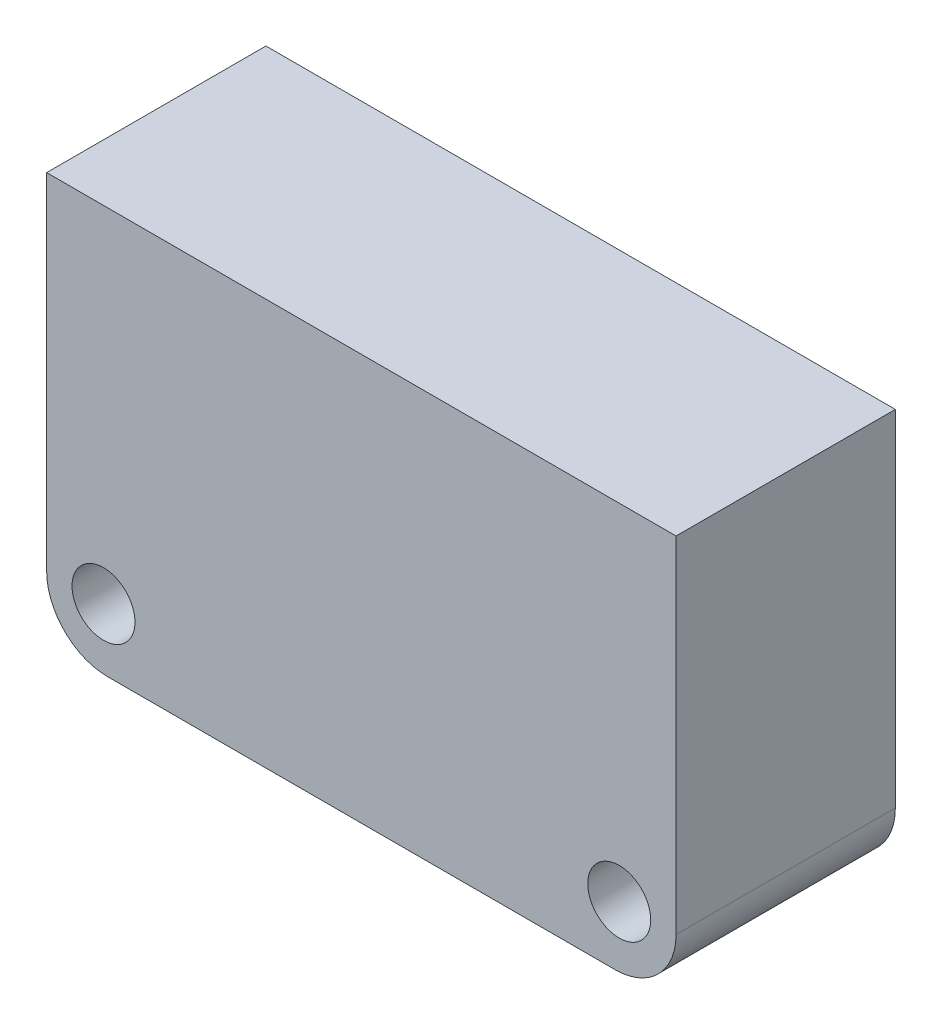
ISO-10303-21;
HEADER;
FILE_DESCRIPTION(('STEP AP214'),'2;1');
FILE_NAME('part.step','',(''),(''),'','','');
FILE_SCHEMA(('AUTOMOTIVE_DESIGN { 1 0 10303 214 1 1 1 1 }'));
ENDSEC;
DATA;
#1=APPLICATION_CONTEXT('core data for automotive mechanical design processes');
#2=APPLICATION_PROTOCOL_DEFINITION('international standard','automotive_design',2000,#1);
#3=PRODUCT_CONTEXT('',#1,'mechanical');
#4=PRODUCT('Part','Part','',(#3));
#5=PRODUCT_RELATED_PRODUCT_CATEGORY('part','',(#4));
#6=PRODUCT_DEFINITION_FORMATION('','',#4);
#7=PRODUCT_DEFINITION_CONTEXT('part definition',#1,'design');
#8=PRODUCT_DEFINITION('design','',#6,#7);
#9=PRODUCT_DEFINITION_SHAPE('','',#8);
#10=(LENGTH_UNIT() NAMED_UNIT(*) SI_UNIT(.MILLI.,.METRE.));
#11=(NAMED_UNIT(*) PLANE_ANGLE_UNIT() SI_UNIT($,.RADIAN.));
#12=(NAMED_UNIT(*) SI_UNIT($,.STERADIAN.) SOLID_ANGLE_UNIT());
#13=UNCERTAINTY_MEASURE_WITH_UNIT(LENGTH_MEASURE(1.E-05),#10,'distance_accuracy_value','');
#14=(GEOMETRIC_REPRESENTATION_CONTEXT(3) GLOBAL_UNCERTAINTY_ASSIGNED_CONTEXT((#13)) GLOBAL_UNIT_ASSIGNED_CONTEXT((#10,
#11,#12)) REPRESENTATION_CONTEXT('',''));
#15=CARTESIAN_POINT('',(0.,0.,0.));
#16=DIRECTION('',(0.,0.,1.));
#17=DIRECTION('',(1.,0.,0.));
#18=AXIS2_PLACEMENT_3D('',#15,#16,#17);
#19=CARTESIAN_POINT('',(12.5,-7.,10.8));
#20=DIRECTION('',(0.,0.,1.));
#21=DIRECTION('',(1.,0.,0.));
#22=AXIS2_PLACEMENT_3D('',#19,#20,#21);
#23=CYLINDRICAL_SURFACE('',#22,3.);
#24=DIRECTION('',(0.,0.,1.));
#25=VECTOR('',#24,1.);
#26=CARTESIAN_POINT('',(12.5,-10.,10.8));
#27=LINE('',#26,#25);
#28=CARTESIAN_POINT('',(12.5,-10.,0.));
#29=VERTEX_POINT('',#28);
#30=CARTESIAN_POINT('',(12.5,-10.,10.8));
#31=VERTEX_POINT('',#30);
#32=EDGE_CURVE('E202',#29,#31,#27,.T.);
#33=ORIENTED_EDGE('',*,*,#32,.F.);
#34=CARTESIAN_POINT('',(12.5,-7.,0.));
#35=DIRECTION('',(0.,0.,1.));
#36=DIRECTION('',(1.,0.,0.));
#37=AXIS2_PLACEMENT_3D('',#34,#35,#36);
#38=CIRCLE('',#37,3.);
#39=CARTESIAN_POINT('',(15.5,-7.,0.));
#40=VERTEX_POINT('',#39);
#41=EDGE_CURVE('E50',#40,#29,#38,.F.);
#42=ORIENTED_EDGE('',*,*,#41,.F.);
#43=DIRECTION('',(0.,0.,1.));
#44=VECTOR('',#43,1.);
#45=CARTESIAN_POINT('',(15.5,-7.,10.8));
#46=LINE('',#45,#44);
#47=CARTESIAN_POINT('',(15.5,-7.,10.8));
#48=VERTEX_POINT('',#47);
#49=EDGE_CURVE('E205',#48,#40,#46,.F.);
#50=ORIENTED_EDGE('',*,*,#49,.F.);
#51=CARTESIAN_POINT('',(12.5,-7.,10.8));
#52=DIRECTION('',(0.,0.,1.));
#53=DIRECTION('',(1.,0.,0.));
#54=AXIS2_PLACEMENT_3D('',#51,#52,#53);
#55=CIRCLE('',#54,3.);
#56=EDGE_CURVE('E11',#31,#48,#55,.T.);
#57=ORIENTED_EDGE('',*,*,#56,.F.);
#58=EDGE_LOOP('',(#33,#42,#50,#57));
#59=FACE_BOUND('',#58,.T.);
#60=ADVANCED_FACE('F43',(#59),#23,.T.);
#61=CARTESIAN_POINT('',(-12.5,-7.,10.8));
#62=DIRECTION('',(0.,0.,1.));
#63=DIRECTION('',(1.,0.,0.));
#64=AXIS2_PLACEMENT_3D('',#61,#62,#63);
#65=CYLINDRICAL_SURFACE('',#64,3.);
#66=DIRECTION('',(0.,0.,1.));
#67=VECTOR('',#66,1.);
#68=CARTESIAN_POINT('',(-15.5,-7.,10.8));
#69=LINE('',#68,#67);
#70=CARTESIAN_POINT('',(-15.5,-7.,0.));
#71=VERTEX_POINT('',#70);
#72=CARTESIAN_POINT('',(-15.5,-7.,10.8));
#73=VERTEX_POINT('',#72);
#74=EDGE_CURVE('E192',#71,#73,#69,.T.);
#75=ORIENTED_EDGE('',*,*,#74,.F.);
#76=CARTESIAN_POINT('',(-12.5,-7.,0.));
#77=DIRECTION('',(0.,0.,1.));
#78=DIRECTION('',(1.,0.,0.));
#79=AXIS2_PLACEMENT_3D('',#76,#77,#78);
#80=CIRCLE('',#79,3.);
#81=CARTESIAN_POINT('',(-12.5,-10.,0.));
#82=VERTEX_POINT('',#81);
#83=EDGE_CURVE('E198',#82,#71,#80,.F.);
#84=ORIENTED_EDGE('',*,*,#83,.F.);
#85=DIRECTION('',(0.,0.,1.));
#86=VECTOR('',#85,1.);
#87=CARTESIAN_POINT('',(-12.5,-10.,10.8));
#88=LINE('',#87,#86);
#89=CARTESIAN_POINT('',(-12.5,-10.,10.8));
#90=VERTEX_POINT('',#89);
#91=EDGE_CURVE('E195',#90,#82,#88,.F.);
#92=ORIENTED_EDGE('',*,*,#91,.F.);
#93=CARTESIAN_POINT('',(-12.5,-7.,10.8));
#94=DIRECTION('',(0.,0.,1.));
#95=DIRECTION('',(1.,0.,0.));
#96=AXIS2_PLACEMENT_3D('',#93,#94,#95);
#97=CIRCLE('',#96,3.);
#98=EDGE_CURVE('E200',#73,#90,#97,.T.);
#99=ORIENTED_EDGE('',*,*,#98,.F.);
#100=EDGE_LOOP('',(#75,#84,#92,#99));
#101=FACE_BOUND('',#100,.T.);
#102=ADVANCED_FACE('F220',(#101),#65,.T.);
#103=CARTESIAN_POINT('',(15.5,10.,10.8));
#104=DIRECTION('',(-1.,0.,0.));
#105=DIRECTION('',(0.,0.,1.));
#106=AXIS2_PLACEMENT_3D('',#103,#104,#105);
#107=PLANE('',#106);
#108=DIRECTION('',(0.,1.,0.));
#109=VECTOR('',#108,1.);
#110=CARTESIAN_POINT('',(15.5,10.,10.8));
#111=LINE('',#110,#109);
#112=CARTESIAN_POINT('',(15.5,10.,10.8));
#113=VERTEX_POINT('',#112);
#114=EDGE_CURVE('E168',#48,#113,#111,.T.);
#115=ORIENTED_EDGE('',*,*,#114,.F.);
#116=ORIENTED_EDGE('',*,*,#49,.T.);
#117=DIRECTION('',(0.,1.,0.));
#118=VECTOR('',#117,1.);
#119=CARTESIAN_POINT('',(15.5,10.,0.));
#120=LINE('',#119,#118);
#121=CARTESIAN_POINT('',(15.5,10.,0.));
#122=VERTEX_POINT('',#121);
#123=EDGE_CURVE('E159',#40,#122,#120,.T.);
#124=ORIENTED_EDGE('',*,*,#123,.T.);
#125=DIRECTION('',(0.,0.,-1.));
#126=VECTOR('',#125,1.);
#127=CARTESIAN_POINT('',(15.5,10.,10.8));
#128=LINE('',#127,#126);
#129=EDGE_CURVE('E189',#113,#122,#128,.T.);
#130=ORIENTED_EDGE('',*,*,#129,.F.);
#131=EDGE_LOOP('',(#115,#116,#124,#130));
#132=FACE_BOUND('',#131,.T.);
#133=ADVANCED_FACE('F232',(#132),#107,.F.);
#134=CARTESIAN_POINT('',(-15.5,10.,10.8));
#135=DIRECTION('',(0.,-1.,0.));
#136=DIRECTION('',(0.,0.,-1.));
#137=AXIS2_PLACEMENT_3D('',#134,#135,#136);
#138=PLANE('',#137);
#139=DIRECTION('',(-1.,0.,0.));
#140=VECTOR('',#139,1.);
#141=CARTESIAN_POINT('',(-15.5,10.,0.));
#142=LINE('',#141,#140);
#143=CARTESIAN_POINT('',(-15.5,10.,0.));
#144=VERTEX_POINT('',#143);
#145=EDGE_CURVE('E180',#122,#144,#142,.T.);
#146=ORIENTED_EDGE('',*,*,#145,.T.);
#147=DIRECTION('',(0.,0.,-1.));
#148=VECTOR('',#147,1.);
#149=CARTESIAN_POINT('',(-15.5,10.,10.8));
#150=LINE('',#149,#148);
#151=CARTESIAN_POINT('',(-15.5,10.,10.8));
#152=VERTEX_POINT('',#151);
#153=EDGE_CURVE('E178',#152,#144,#150,.T.);
#154=ORIENTED_EDGE('',*,*,#153,.F.);
#155=DIRECTION('',(-1.,0.,0.));
#156=VECTOR('',#155,1.);
#157=CARTESIAN_POINT('',(-15.5,10.,10.8));
#158=LINE('',#157,#156);
#159=EDGE_CURVE('E170',#113,#152,#158,.T.);
#160=ORIENTED_EDGE('',*,*,#159,.F.);
#161=ORIENTED_EDGE('',*,*,#129,.T.);
#162=EDGE_LOOP('',(#146,#154,#160,#161));
#163=FACE_BOUND('',#162,.T.);
#164=ADVANCED_FACE('F228',(#163),#138,.F.);
#165=CARTESIAN_POINT('',(-15.5,10.,10.8));
#166=DIRECTION('',(1.,0.,0.));
#167=DIRECTION('',(0.,0.,-1.));
#168=AXIS2_PLACEMENT_3D('',#165,#166,#167);
#169=PLANE('',#168);
#170=DIRECTION('',(0.,-1.,0.));
#171=VECTOR('',#170,1.);
#172=CARTESIAN_POINT('',(-15.5,10.,0.));
#173=LINE('',#172,#171);
#174=EDGE_CURVE('E182',#144,#71,#173,.T.);
#175=ORIENTED_EDGE('',*,*,#174,.T.);
#176=ORIENTED_EDGE('',*,*,#74,.T.);
#177=DIRECTION('',(0.,-1.,0.));
#178=VECTOR('',#177,1.);
#179=CARTESIAN_POINT('',(-15.5,10.,10.8));
#180=LINE('',#179,#178);
#181=EDGE_CURVE('E173',#152,#73,#180,.T.);
#182=ORIENTED_EDGE('',*,*,#181,.F.);
#183=ORIENTED_EDGE('',*,*,#153,.T.);
#184=EDGE_LOOP('',(#175,#176,#182,#183));
#185=FACE_BOUND('',#184,.T.);
#186=ADVANCED_FACE('F223',(#185),#169,.F.);
#187=CARTESIAN_POINT('',(-15.5,-10.,10.8));
#188=DIRECTION('',(0.,1.,0.));
#189=DIRECTION('',(0.,0.,1.));
#190=AXIS2_PLACEMENT_3D('',#187,#188,#189);
#191=PLANE('',#190);
#192=DIRECTION('',(-1.,0.,0.));
#193=VECTOR('',#192,1.);
#194=CARTESIAN_POINT('',(-7.5,-10.,7.9));
#195=LINE('',#194,#193);
#196=CARTESIAN_POINT('',(7.5,-10.,7.9));
#197=VERTEX_POINT('',#196);
#198=CARTESIAN_POINT('',(-7.5,-10.,7.9));
#199=VERTEX_POINT('',#198);
#200=EDGE_CURVE('E146',#197,#199,#195,.T.);
#201=ORIENTED_EDGE('',*,*,#200,.F.);
#202=DIRECTION('',(0.,0.,1.));
#203=VECTOR('',#202,1.);
#204=CARTESIAN_POINT('',(7.5,-10.,7.9));
#205=LINE('',#204,#203);
#206=CARTESIAN_POINT('',(7.5,-10.,2.9));
#207=VERTEX_POINT('',#206);
#208=EDGE_CURVE('E57',#207,#197,#205,.T.);
#209=ORIENTED_EDGE('',*,*,#208,.F.);
#210=DIRECTION('',(1.,0.,0.));
#211=VECTOR('',#210,1.);
#212=CARTESIAN_POINT('',(-7.5,-10.,2.9));
#213=LINE('',#212,#211);
#214=CARTESIAN_POINT('',(-7.5,-10.,2.9));
#215=VERTEX_POINT('',#214);
#216=EDGE_CURVE('E137',#215,#207,#213,.T.);
#217=ORIENTED_EDGE('',*,*,#216,.F.);
#218=DIRECTION('',(0.,0.,-1.));
#219=VECTOR('',#218,1.);
#220=CARTESIAN_POINT('',(-7.5,-10.,7.9));
#221=LINE('',#220,#219);
#222=EDGE_CURVE('E140',#199,#215,#221,.T.);
#223=ORIENTED_EDGE('',*,*,#222,.F.);
#224=EDGE_LOOP('',(#201,#209,#217,#223));
#225=FACE_BOUND('',#224,.T.);
#226=DIRECTION('',(1.,0.,0.));
#227=VECTOR('',#226,1.);
#228=CARTESIAN_POINT('',(-15.5,-10.,0.));
#229=LINE('',#228,#227);
#230=EDGE_CURVE('E171',#82,#29,#229,.T.);
#231=ORIENTED_EDGE('',*,*,#230,.T.);
#232=ORIENTED_EDGE('',*,*,#32,.T.);
#233=DIRECTION('',(1.,0.,0.));
#234=VECTOR('',#233,1.);
#235=CARTESIAN_POINT('',(-15.5,-10.,10.8));
#236=LINE('',#235,#234);
#237=EDGE_CURVE('E176',#90,#31,#236,.T.);
#238=ORIENTED_EDGE('',*,*,#237,.F.);
#239=ORIENTED_EDGE('',*,*,#91,.T.);
#240=EDGE_LOOP('',(#231,#232,#238,#239));
#241=FACE_BOUND('',#240,.T.);
#242=ADVANCED_FACE('F216',(#225,#241),#191,.F.);
#243=CARTESIAN_POINT('',(0.,0.,10.8));
#244=DIRECTION('',(0.,0.,1.));
#245=DIRECTION('',(1.,0.,0.));
#246=AXIS2_PLACEMENT_3D('',#243,#244,#245);
#247=PLANE('',#246);
#248=CARTESIAN_POINT('',(12.7,-7.,10.8));
#249=DIRECTION('',(0.,0.,-1.));
#250=DIRECTION('',(-1.,0.,0.));
#251=AXIS2_PLACEMENT_3D('',#248,#249,#250);
#252=CIRCLE('',#251,1.55);
#253=CARTESIAN_POINT('',(11.15,-7.,10.8));
#254=VERTEX_POINT('',#253);
#255=EDGE_CURVE('E156',#254,#254,#252,.T.);
#256=ORIENTED_EDGE('',*,*,#255,.T.);
#257=EDGE_LOOP('',(#256));
#258=FACE_BOUND('',#257,.T.);
#259=CARTESIAN_POINT('',(-12.7,-7.,10.8));
#260=DIRECTION('',(0.,0.,-1.));
#261=DIRECTION('',(-1.,0.,0.));
#262=AXIS2_PLACEMENT_3D('',#259,#260,#261);
#263=CIRCLE('',#262,1.55);
#264=CARTESIAN_POINT('',(-14.25,-7.,10.8));
#265=VERTEX_POINT('',#264);
#266=EDGE_CURVE('E152',#265,#265,#263,.T.);
#267=ORIENTED_EDGE('',*,*,#266,.T.);
#268=EDGE_LOOP('',(#267));
#269=FACE_BOUND('',#268,.T.);
#270=ORIENTED_EDGE('',*,*,#237,.T.);
#271=ORIENTED_EDGE('',*,*,#56,.T.);
#272=ORIENTED_EDGE('',*,*,#114,.T.);
#273=ORIENTED_EDGE('',*,*,#159,.T.);
#274=ORIENTED_EDGE('',*,*,#181,.T.);
#275=ORIENTED_EDGE('',*,*,#98,.T.);
#276=EDGE_LOOP('',(#270,#271,#272,#273,#274,#275));
#277=FACE_BOUND('',#276,.T.);
#278=ADVANCED_FACE('F233',(#258,#269,#277),#247,.T.);
#279=CARTESIAN_POINT('',(0.,0.,0.));
#280=DIRECTION('',(0.,0.,1.));
#281=DIRECTION('',(1.,0.,0.));
#282=AXIS2_PLACEMENT_3D('',#279,#280,#281);
#283=PLANE('',#282);
#284=CARTESIAN_POINT('',(12.7,-7.,0.));
#285=DIRECTION('',(0.,0.,-1.));
#286=DIRECTION('',(-1.,0.,0.));
#287=AXIS2_PLACEMENT_3D('',#284,#285,#286);
#288=CIRCLE('',#287,1.55);
#289=CARTESIAN_POINT('',(11.15,-7.,0.));
#290=VERTEX_POINT('',#289);
#291=EDGE_CURVE('E160',#290,#290,#288,.T.);
#292=ORIENTED_EDGE('',*,*,#291,.F.);
#293=EDGE_LOOP('',(#292));
#294=FACE_BOUND('',#293,.T.);
#295=CARTESIAN_POINT('',(-12.7,-7.,0.));
#296=DIRECTION('',(0.,0.,-1.));
#297=DIRECTION('',(-1.,0.,0.));
#298=AXIS2_PLACEMENT_3D('',#295,#296,#297);
#299=CIRCLE('',#298,1.55);
#300=CARTESIAN_POINT('',(-14.25,-7.,0.));
#301=VERTEX_POINT('',#300);
#302=EDGE_CURVE('E163',#301,#301,#299,.T.);
#303=ORIENTED_EDGE('',*,*,#302,.F.);
#304=EDGE_LOOP('',(#303));
#305=FACE_BOUND('',#304,.T.);
#306=ORIENTED_EDGE('',*,*,#123,.F.);
#307=ORIENTED_EDGE('',*,*,#41,.T.);
#308=ORIENTED_EDGE('',*,*,#230,.F.);
#309=ORIENTED_EDGE('',*,*,#83,.T.);
#310=ORIENTED_EDGE('',*,*,#174,.F.);
#311=ORIENTED_EDGE('',*,*,#145,.F.);
#312=EDGE_LOOP('',(#306,#307,#308,#309,#310,#311));
#313=FACE_BOUND('',#312,.T.);
#314=ADVANCED_FACE('F211',(#294,#305,#313),#283,.F.);
#315=CARTESIAN_POINT('',(-12.7,-7.,10.8));
#316=DIRECTION('',(0.,0.,-1.));
#317=DIRECTION('',(-1.,0.,0.));
#318=AXIS2_PLACEMENT_3D('',#315,#316,#317);
#319=CYLINDRICAL_SURFACE('',#318,1.55);
#320=CARTESIAN_POINT('',(-14.25,-7.,10.8));
#321=CARTESIAN_POINT('',(-14.25,-7.,10.6875));
#322=CARTESIAN_POINT('',(-14.25,-7.,10.575));
#323=CARTESIAN_POINT('',(-14.25,-7.,10.35));
#324=CARTESIAN_POINT('',(-14.25,-7.,10.2375));
#325=CARTESIAN_POINT('',(-14.25,-7.,10.0125));
#326=CARTESIAN_POINT('',(-14.25,-7.,9.9));
#327=CARTESIAN_POINT('',(-14.25,-7.,9.675));
#328=CARTESIAN_POINT('',(-14.25,-7.,9.5625));
#329=CARTESIAN_POINT('',(-14.25,-7.,9.3375));
#330=CARTESIAN_POINT('',(-14.25,-7.,9.225));
#331=CARTESIAN_POINT('',(-14.25,-7.,9.));
#332=CARTESIAN_POINT('',(-14.25,-7.,8.8875));
#333=CARTESIAN_POINT('',(-14.25,-7.,8.6625));
#334=CARTESIAN_POINT('',(-14.25,-7.,8.55));
#335=CARTESIAN_POINT('',(-14.25,-7.,8.325));
#336=CARTESIAN_POINT('',(-14.25,-7.,8.2125));
#337=CARTESIAN_POINT('',(-14.25,-7.,7.9875));
#338=CARTESIAN_POINT('',(-14.25,-7.,7.875));
#339=CARTESIAN_POINT('',(-14.25,-7.,7.65));
#340=CARTESIAN_POINT('',(-14.25,-7.,7.5375));
#341=CARTESIAN_POINT('',(-14.25,-7.,7.3125));
#342=CARTESIAN_POINT('',(-14.25,-7.,7.2));
#343=CARTESIAN_POINT('',(-14.25,-7.,6.975));
#344=CARTESIAN_POINT('',(-14.25,-7.,6.8625));
#345=CARTESIAN_POINT('',(-14.25,-7.,6.6375));
#346=CARTESIAN_POINT('',(-14.25,-7.,6.525));
#347=CARTESIAN_POINT('',(-14.25,-7.,6.3));
#348=CARTESIAN_POINT('',(-14.25,-7.,6.1875));
#349=CARTESIAN_POINT('',(-14.25,-7.,5.9625));
#350=CARTESIAN_POINT('',(-14.25,-7.,5.85));
#351=CARTESIAN_POINT('',(-14.25,-7.,5.625));
#352=CARTESIAN_POINT('',(-14.25,-7.,5.5125));
#353=CARTESIAN_POINT('',(-14.25,-7.,5.2875));
#354=CARTESIAN_POINT('',(-14.25,-7.,5.175));
#355=CARTESIAN_POINT('',(-14.25,-7.,4.95));
#356=CARTESIAN_POINT('',(-14.25,-7.,4.8375));
#357=CARTESIAN_POINT('',(-14.25,-7.,4.6125));
#358=CARTESIAN_POINT('',(-14.25,-7.,4.5));
#359=CARTESIAN_POINT('',(-14.25,-7.,4.275));
#360=CARTESIAN_POINT('',(-14.25,-7.,4.1625));
#361=CARTESIAN_POINT('',(-14.25,-7.,3.9375));
#362=CARTESIAN_POINT('',(-14.25,-7.,3.825));
#363=CARTESIAN_POINT('',(-14.25,-7.,3.6));
#364=CARTESIAN_POINT('',(-14.25,-7.,3.4875));
#365=CARTESIAN_POINT('',(-14.25,-7.,3.2625));
#366=CARTESIAN_POINT('',(-14.25,-7.,3.15));
#367=CARTESIAN_POINT('',(-14.25,-7.,2.925));
#368=CARTESIAN_POINT('',(-14.25,-7.,2.8125));
#369=CARTESIAN_POINT('',(-14.25,-7.,2.5875));
#370=CARTESIAN_POINT('',(-14.25,-7.,2.475));
#371=CARTESIAN_POINT('',(-14.25,-7.,2.25));
#372=CARTESIAN_POINT('',(-14.25,-7.,2.1375));
#373=CARTESIAN_POINT('',(-14.25,-7.,1.9125));
#374=CARTESIAN_POINT('',(-14.25,-7.,1.8));
#375=CARTESIAN_POINT('',(-14.25,-7.,1.575));
#376=CARTESIAN_POINT('',(-14.25,-7.,1.4625));
#377=CARTESIAN_POINT('',(-14.25,-7.,1.2375));
#378=CARTESIAN_POINT('',(-14.25,-7.,1.125));
#379=CARTESIAN_POINT('',(-14.25,-7.,0.900000000000001));
#380=CARTESIAN_POINT('',(-14.25,-7.,0.787500000000002));
#381=CARTESIAN_POINT('',(-14.25,-7.,0.562500000000002));
#382=CARTESIAN_POINT('',(-14.25,-7.,0.450000000000001));
#383=CARTESIAN_POINT('',(-14.25,-7.,0.225000000000001));
#384=CARTESIAN_POINT('',(-14.25,-7.,0.112500000000001));
#385=CARTESIAN_POINT('',(-14.25,-7.,0.));
#386=B_SPLINE_CURVE_WITH_KNOTS('',3,(#320,#321,#322,#323,#324,#325,#326,#327,#328,#329,#330,
#331,#332,#333,#334,#335,#336,#337,#338,#339,#340,#341,#342,#343,#344,#345,#346,#347,#348,#349,
#350,#351,#352,#353,#354,#355,#356,#357,#358,#359,#360,#361,#362,#363,#364,#365,#366,#367,#368,
#369,#370,#371,#372,#373,#374,#375,#376,#377,#378,#379,#380,#381,#382,#383,#384,#385),
.UNSPECIFIED.,.F.,.F.,(4,2,2,2,2,2,2,2,2,2,2,2,2,2,2,2,2,2,2,2,2,2,2,2,2,2,2,2,2,2,2,2,4),(0.,
0.337499999999999,0.674999999999998,1.0125,1.35,1.6875,2.025,2.3625,2.7,3.0375,3.375,3.7125,
4.05,4.3875,4.725,5.0625,5.4,5.7375,6.075,6.4125,6.75,7.0875,7.425,7.7625,8.1,8.4375,8.775,
9.1125,9.45,9.7875,10.125,10.4625,10.8),.UNSPECIFIED.);
#387=EDGE_CURVE('BSEAM241',#265,#301,#386,.T.);
#388=ORIENTED_EDGE('',*,*,#266,.F.);
#389=ORIENTED_EDGE('',*,*,#302,.T.);
#390=ORIENTED_EDGE('',*,*,#387,.T.);
#391=ORIENTED_EDGE('',*,*,#387,.F.);
#392=EDGE_LOOP('',(#388,#390,#389,#391));
#393=FACE_BOUND('',#392,.T.);
#394=ADVANCED_FACE('F241',(#393),#319,.F.);
#395=CARTESIAN_POINT('',(12.7,-7.,10.8));
#396=DIRECTION('',(0.,0.,-1.));
#397=DIRECTION('',(-1.,0.,0.));
#398=AXIS2_PLACEMENT_3D('',#395,#396,#397);
#399=CYLINDRICAL_SURFACE('',#398,1.55);
#400=CARTESIAN_POINT('',(11.15,-7.,10.8));
#401=CARTESIAN_POINT('',(11.15,-7.,10.6875));
#402=CARTESIAN_POINT('',(11.15,-7.,10.575));
#403=CARTESIAN_POINT('',(11.15,-7.,10.35));
#404=CARTESIAN_POINT('',(11.15,-7.,10.2375));
#405=CARTESIAN_POINT('',(11.15,-7.,10.0125));
#406=CARTESIAN_POINT('',(11.15,-7.,9.9));
#407=CARTESIAN_POINT('',(11.15,-7.,9.675));
#408=CARTESIAN_POINT('',(11.15,-7.,9.5625));
#409=CARTESIAN_POINT('',(11.15,-7.,9.3375));
#410=CARTESIAN_POINT('',(11.15,-7.,9.225));
#411=CARTESIAN_POINT('',(11.15,-7.,9.));
#412=CARTESIAN_POINT('',(11.15,-7.,8.8875));
#413=CARTESIAN_POINT('',(11.15,-7.,8.6625));
#414=CARTESIAN_POINT('',(11.15,-7.,8.55));
#415=CARTESIAN_POINT('',(11.15,-7.,8.325));
#416=CARTESIAN_POINT('',(11.15,-7.,8.2125));
#417=CARTESIAN_POINT('',(11.15,-7.,7.9875));
#418=CARTESIAN_POINT('',(11.15,-7.,7.875));
#419=CARTESIAN_POINT('',(11.15,-7.,7.65));
#420=CARTESIAN_POINT('',(11.15,-7.,7.5375));
#421=CARTESIAN_POINT('',(11.15,-7.,7.3125));
#422=CARTESIAN_POINT('',(11.15,-7.,7.2));
#423=CARTESIAN_POINT('',(11.15,-7.,6.975));
#424=CARTESIAN_POINT('',(11.15,-7.,6.8625));
#425=CARTESIAN_POINT('',(11.15,-7.,6.6375));
#426=CARTESIAN_POINT('',(11.15,-7.,6.525));
#427=CARTESIAN_POINT('',(11.15,-7.,6.3));
#428=CARTESIAN_POINT('',(11.15,-7.,6.1875));
#429=CARTESIAN_POINT('',(11.15,-7.,5.9625));
#430=CARTESIAN_POINT('',(11.15,-7.,5.85));
#431=CARTESIAN_POINT('',(11.15,-7.,5.625));
#432=CARTESIAN_POINT('',(11.15,-7.,5.5125));
#433=CARTESIAN_POINT('',(11.15,-7.,5.2875));
#434=CARTESIAN_POINT('',(11.15,-7.,5.175));
#435=CARTESIAN_POINT('',(11.15,-7.,4.95));
#436=CARTESIAN_POINT('',(11.15,-7.,4.8375));
#437=CARTESIAN_POINT('',(11.15,-7.,4.6125));
#438=CARTESIAN_POINT('',(11.15,-7.,4.5));
#439=CARTESIAN_POINT('',(11.15,-7.,4.275));
#440=CARTESIAN_POINT('',(11.15,-7.,4.1625));
#441=CARTESIAN_POINT('',(11.15,-7.,3.9375));
#442=CARTESIAN_POINT('',(11.15,-7.,3.825));
#443=CARTESIAN_POINT('',(11.15,-7.,3.6));
#444=CARTESIAN_POINT('',(11.15,-7.,3.4875));
#445=CARTESIAN_POINT('',(11.15,-7.,3.2625));
#446=CARTESIAN_POINT('',(11.15,-7.,3.15));
#447=CARTESIAN_POINT('',(11.15,-7.,2.925));
#448=CARTESIAN_POINT('',(11.15,-7.,2.8125));
#449=CARTESIAN_POINT('',(11.15,-7.,2.5875));
#450=CARTESIAN_POINT('',(11.15,-7.,2.475));
#451=CARTESIAN_POINT('',(11.15,-7.,2.25));
#452=CARTESIAN_POINT('',(11.15,-7.,2.1375));
#453=CARTESIAN_POINT('',(11.15,-7.,1.9125));
#454=CARTESIAN_POINT('',(11.15,-7.,1.8));
#455=CARTESIAN_POINT('',(11.15,-7.,1.575));
#456=CARTESIAN_POINT('',(11.15,-7.,1.4625));
#457=CARTESIAN_POINT('',(11.15,-7.,1.2375));
#458=CARTESIAN_POINT('',(11.15,-7.,1.125));
#459=CARTESIAN_POINT('',(11.15,-7.,0.900000000000001));
#460=CARTESIAN_POINT('',(11.15,-7.,0.787500000000002));
#461=CARTESIAN_POINT('',(11.15,-7.,0.562500000000002));
#462=CARTESIAN_POINT('',(11.15,-7.,0.450000000000001));
#463=CARTESIAN_POINT('',(11.15,-7.,0.225000000000001));
#464=CARTESIAN_POINT('',(11.15,-7.,0.112500000000001));
#465=CARTESIAN_POINT('',(11.15,-7.,0.));
#466=B_SPLINE_CURVE_WITH_KNOTS('',3,(#400,#401,#402,#403,#404,#405,#406,#407,#408,#409,#410,
#411,#412,#413,#414,#415,#416,#417,#418,#419,#420,#421,#422,#423,#424,#425,#426,#427,#428,#429,
#430,#431,#432,#433,#434,#435,#436,#437,#438,#439,#440,#441,#442,#443,#444,#445,#446,#447,#448,
#449,#450,#451,#452,#453,#454,#455,#456,#457,#458,#459,#460,#461,#462,#463,#464,#465),
.UNSPECIFIED.,.F.,.F.,(4,2,2,2,2,2,2,2,2,2,2,2,2,2,2,2,2,2,2,2,2,2,2,2,2,2,2,2,2,2,2,2,4),(0.,
0.337499999999999,0.674999999999998,1.0125,1.35,1.6875,2.025,2.3625,2.7,3.0375,3.375,3.7125,
4.05,4.3875,4.725,5.0625,5.4,5.7375,6.075,6.4125,6.75,7.0875,7.425,7.7625,8.1,8.4375,8.775,
9.1125,9.45,9.7875,10.125,10.4625,10.8),.UNSPECIFIED.);
#467=EDGE_CURVE('BSEAM295',#254,#290,#466,.T.);
#468=ORIENTED_EDGE('',*,*,#255,.F.);
#469=ORIENTED_EDGE('',*,*,#291,.T.);
#470=ORIENTED_EDGE('',*,*,#467,.T.);
#471=ORIENTED_EDGE('',*,*,#467,.F.);
#472=EDGE_LOOP('',(#468,#470,#469,#471));
#473=FACE_BOUND('',#472,.T.);
#474=ADVANCED_FACE('F295',(#473),#399,.F.);
#475=CARTESIAN_POINT('',(7.5,-7.,7.9));
#476=DIRECTION('',(1.,0.,0.));
#477=DIRECTION('',(0.,0.,-1.));
#478=AXIS2_PLACEMENT_3D('',#475,#476,#477);
#479=PLANE('',#478);
#480=ORIENTED_EDGE('',*,*,#208,.T.);
#481=DIRECTION('',(0.,-1.,0.));
#482=VECTOR('',#481,1.);
#483=CARTESIAN_POINT('',(7.5,-7.,7.9));
#484=LINE('',#483,#482);
#485=CARTESIAN_POINT('',(7.5,-7.,7.9));
#486=VERTEX_POINT('',#485);
#487=EDGE_CURVE('E115',#486,#197,#484,.T.);
#488=ORIENTED_EDGE('',*,*,#487,.F.);
#489=DIRECTION('',(0.,0.,1.));
#490=VECTOR('',#489,1.);
#491=CARTESIAN_POINT('',(7.5,-7.,7.9));
#492=LINE('',#491,#490);
#493=CARTESIAN_POINT('',(7.5,-7.,2.9));
#494=VERTEX_POINT('',#493);
#495=EDGE_CURVE('E119',#494,#486,#492,.T.);
#496=ORIENTED_EDGE('',*,*,#495,.F.);
#497=DIRECTION('',(0.,-1.,0.));
#498=VECTOR('',#497,1.);
#499=CARTESIAN_POINT('',(7.5,-7.,2.9));
#500=LINE('',#499,#498);
#501=EDGE_CURVE('E150',#494,#207,#500,.T.);
#502=ORIENTED_EDGE('',*,*,#501,.T.);
#503=EDGE_LOOP('',(#480,#488,#496,#502));
#504=FACE_BOUND('',#503,.T.);
#505=ADVANCED_FACE('F117',(#504),#479,.F.);
#506=CARTESIAN_POINT('',(-7.5,-7.,2.9));
#507=DIRECTION('',(0.,0.,-1.));
#508=DIRECTION('',(-1.,0.,0.));
#509=AXIS2_PLACEMENT_3D('',#506,#507,#508);
#510=PLANE('',#509);
#511=ORIENTED_EDGE('',*,*,#216,.T.);
#512=ORIENTED_EDGE('',*,*,#501,.F.);
#513=DIRECTION('',(1.,0.,0.));
#514=VECTOR('',#513,1.);
#515=CARTESIAN_POINT('',(-7.5,-7.,2.9));
#516=LINE('',#515,#514);
#517=CARTESIAN_POINT('',(-7.5,-7.,2.9));
#518=VERTEX_POINT('',#517);
#519=EDGE_CURVE('E125',#518,#494,#516,.T.);
#520=ORIENTED_EDGE('',*,*,#519,.F.);
#521=DIRECTION('',(0.,-1.,0.));
#522=VECTOR('',#521,1.);
#523=CARTESIAN_POINT('',(-7.5,-7.,2.9));
#524=LINE('',#523,#522);
#525=EDGE_CURVE('E153',#518,#215,#524,.T.);
#526=ORIENTED_EDGE('',*,*,#525,.T.);
#527=EDGE_LOOP('',(#511,#512,#520,#526));
#528=FACE_BOUND('',#527,.T.);
#529=ADVANCED_FACE('F319',(#528),#510,.F.);
#530=CARTESIAN_POINT('',(-7.5,-7.,7.9));
#531=DIRECTION('',(-1.,0.,0.));
#532=DIRECTION('',(0.,0.,1.));
#533=AXIS2_PLACEMENT_3D('',#530,#531,#532);
#534=PLANE('',#533);
#535=ORIENTED_EDGE('',*,*,#222,.T.);
#536=ORIENTED_EDGE('',*,*,#525,.F.);
#537=DIRECTION('',(0.,0.,-1.));
#538=VECTOR('',#537,1.);
#539=CARTESIAN_POINT('',(-7.5,-7.,7.9));
#540=LINE('',#539,#538);
#541=CARTESIAN_POINT('',(-7.5,-7.,7.9));
#542=VERTEX_POINT('',#541);
#543=EDGE_CURVE('E133',#542,#518,#540,.T.);
#544=ORIENTED_EDGE('',*,*,#543,.F.);
#545=DIRECTION('',(0.,-1.,0.));
#546=VECTOR('',#545,1.);
#547=CARTESIAN_POINT('',(-7.5,-7.,7.9));
#548=LINE('',#547,#546);
#549=EDGE_CURVE('E124',#542,#199,#548,.T.);
#550=ORIENTED_EDGE('',*,*,#549,.T.);
#551=EDGE_LOOP('',(#535,#536,#544,#550));
#552=FACE_BOUND('',#551,.T.);
#553=ADVANCED_FACE('F328',(#552),#534,.F.);
#554=CARTESIAN_POINT('',(-7.5,-7.,7.9));
#555=DIRECTION('',(0.,0.,1.));
#556=DIRECTION('',(1.,0.,0.));
#557=AXIS2_PLACEMENT_3D('',#554,#555,#556);
#558=PLANE('',#557);
#559=ORIENTED_EDGE('',*,*,#200,.T.);
#560=ORIENTED_EDGE('',*,*,#549,.F.);
#561=DIRECTION('',(-1.,0.,0.));
#562=VECTOR('',#561,1.);
#563=CARTESIAN_POINT('',(-7.5,-7.,7.9));
#564=LINE('',#563,#562);
#565=EDGE_CURVE('E128',#486,#542,#564,.T.);
#566=ORIENTED_EDGE('',*,*,#565,.F.);
#567=ORIENTED_EDGE('',*,*,#487,.T.);
#568=EDGE_LOOP('',(#559,#560,#566,#567));
#569=FACE_BOUND('',#568,.T.);
#570=ADVANCED_FACE('F129',(#569),#558,.F.);
#571=CARTESIAN_POINT('',(0.,-7.,0.));
#572=DIRECTION('',(0.,-1.,0.));
#573=DIRECTION('',(0.,0.,-1.));
#574=AXIS2_PLACEMENT_3D('',#571,#572,#573);
#575=PLANE('',#574);
#576=ORIENTED_EDGE('',*,*,#495,.T.);
#577=ORIENTED_EDGE('',*,*,#565,.T.);
#578=ORIENTED_EDGE('',*,*,#543,.T.);
#579=ORIENTED_EDGE('',*,*,#519,.T.);
#580=EDGE_LOOP('',(#576,#577,#578,#579));
#581=FACE_BOUND('',#580,.T.);
#582=ADVANCED_FACE('F135',(#581),#575,.T.);
#583=CLOSED_SHELL('',(#60,#102,#133,#164,#186,#242,#278,#314,#394,#474,#505,#529,#553,#570,#582));
#584=MANIFOLD_SOLID_BREP('B2',#583);
#585=ADVANCED_BREP_SHAPE_REPRESENTATION('',(#18,#584),#14);
#586=SHAPE_DEFINITION_REPRESENTATION(#9,#585);
ENDSEC;
END-ISO-10303-21;
